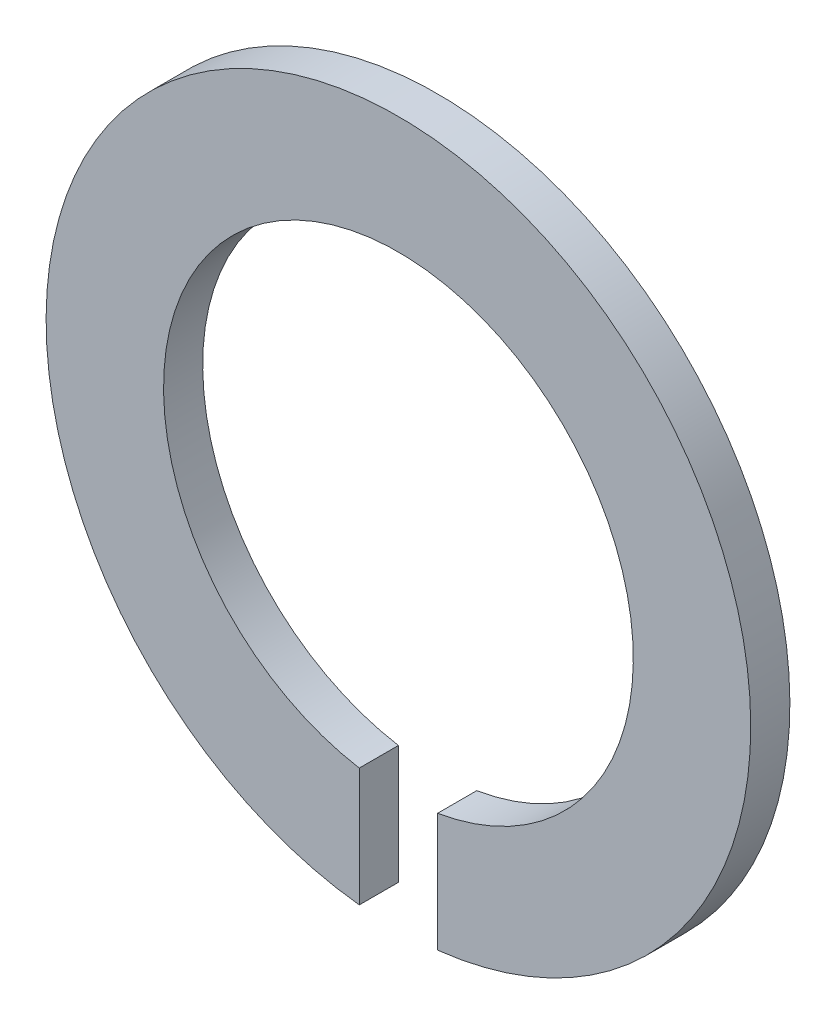
ISO-10303-21;
HEADER;
FILE_DESCRIPTION(('STEP AP214'),'2;1');
FILE_NAME('part.step','',(''),(''),'','','');
FILE_SCHEMA(('AUTOMOTIVE_DESIGN { 1 0 10303 214 1 1 1 1 }'));
ENDSEC;
DATA;
#1=APPLICATION_CONTEXT('core data for automotive mechanical design processes');
#2=APPLICATION_PROTOCOL_DEFINITION('international standard','automotive_design',2000,#1);
#3=PRODUCT_CONTEXT('',#1,'mechanical');
#4=PRODUCT('Part','Part','',(#3));
#5=PRODUCT_RELATED_PRODUCT_CATEGORY('part','',(#4));
#6=PRODUCT_DEFINITION_FORMATION('','',#4);
#7=PRODUCT_DEFINITION_CONTEXT('part definition',#1,'design');
#8=PRODUCT_DEFINITION('design','',#6,#7);
#9=PRODUCT_DEFINITION_SHAPE('','',#8);
#10=(LENGTH_UNIT() NAMED_UNIT(*) SI_UNIT(.MILLI.,.METRE.));
#11=(NAMED_UNIT(*) PLANE_ANGLE_UNIT() SI_UNIT($,.RADIAN.));
#12=(NAMED_UNIT(*) SI_UNIT($,.STERADIAN.) SOLID_ANGLE_UNIT());
#13=UNCERTAINTY_MEASURE_WITH_UNIT(LENGTH_MEASURE(1.E-05),#10,'distance_accuracy_value','');
#14=(GEOMETRIC_REPRESENTATION_CONTEXT(3) GLOBAL_UNCERTAINTY_ASSIGNED_CONTEXT((#13)) GLOBAL_UNIT_ASSIGNED_CONTEXT((#10,
#11,#12)) REPRESENTATION_CONTEXT('',''));
#15=CARTESIAN_POINT('',(0.,0.,0.));
#16=DIRECTION('',(0.,0.,1.));
#17=DIRECTION('',(1.,0.,0.));
#18=AXIS2_PLACEMENT_3D('',#15,#16,#17);
#19=CARTESIAN_POINT('',(0.,0.,0.5));
#20=DIRECTION('',(0.,0.,-1.));
#21=DIRECTION('',(-1.,0.,0.));
#22=AXIS2_PLACEMENT_3D('',#19,#20,#21);
#23=CYLINDRICAL_SURFACE('',#22,4.5);
#24=CARTESIAN_POINT('',(0.,0.,0.));
#25=DIRECTION('',(0.,0.,1.));
#26=DIRECTION('',(1.,0.,0.));
#27=AXIS2_PLACEMENT_3D('',#24,#25,#26);
#28=CIRCLE('',#27,4.5);
#29=CARTESIAN_POINT('',(0.500000000000001,-4.47213595499958,0.));
#30=VERTEX_POINT('',#29);
#31=CARTESIAN_POINT('',(-0.499999999999999,-4.47213595499958,0.));
#32=VERTEX_POINT('',#31);
#33=EDGE_CURVE('E113',#30,#32,#28,.T.);
#34=ORIENTED_EDGE('',*,*,#33,.T.);
#35=DIRECTION('',(0.,0.,-1.));
#36=VECTOR('',#35,1.);
#37=CARTESIAN_POINT('',(-0.499999999999999,-4.47213595499958,0.5));
#38=LINE('',#37,#36);
#39=CARTESIAN_POINT('',(-0.499999999999999,-4.47213595499958,0.5));
#40=VERTEX_POINT('',#39);
#41=EDGE_CURVE('E11',#40,#32,#38,.T.);
#42=ORIENTED_EDGE('',*,*,#41,.F.);
#43=CARTESIAN_POINT('',(0.,0.,0.5));
#44=DIRECTION('',(0.,0.,1.));
#45=DIRECTION('',(1.,0.,0.));
#46=AXIS2_PLACEMENT_3D('',#43,#44,#45);
#47=CIRCLE('',#46,4.5);
#48=CARTESIAN_POINT('',(0.500000000000001,-4.47213595499958,0.5));
#49=VERTEX_POINT('',#48);
#50=EDGE_CURVE('E97',#49,#40,#47,.T.);
#51=ORIENTED_EDGE('',*,*,#50,.F.);
#52=DIRECTION('',(0.,0.,-1.));
#53=VECTOR('',#52,1.);
#54=CARTESIAN_POINT('',(0.500000000000001,-4.47213595499958,0.5));
#55=LINE('',#54,#53);
#56=EDGE_CURVE('E109',#49,#30,#55,.T.);
#57=ORIENTED_EDGE('',*,*,#56,.T.);
#58=EDGE_LOOP('',(#34,#42,#51,#57));
#59=FACE_BOUND('',#58,.T.);
#60=ADVANCED_FACE('F45',(#59),#23,.T.);
#61=CARTESIAN_POINT('',(-0.499999999999999,-4.47213595499958,0.5));
#62=DIRECTION('',(-1.,0.,0.));
#63=DIRECTION('',(0.,-1.,0.));
#64=AXIS2_PLACEMENT_3D('',#61,#62,#63);
#65=PLANE('',#64);
#66=DIRECTION('',(0.,1.,0.));
#67=VECTOR('',#66,1.);
#68=CARTESIAN_POINT('',(-0.499999999999999,-4.47213595499958,0.));
#69=LINE('',#68,#67);
#70=CARTESIAN_POINT('',(-0.499999999999999,-2.95803989154981,0.));
#71=VERTEX_POINT('',#70);
#72=EDGE_CURVE('E102',#32,#71,#69,.T.);
#73=ORIENTED_EDGE('',*,*,#72,.T.);
#74=DIRECTION('',(0.,0.,-1.));
#75=VECTOR('',#74,1.);
#76=CARTESIAN_POINT('',(-0.499999999999999,-2.95803989154981,0.5));
#77=LINE('',#76,#75);
#78=CARTESIAN_POINT('',(-0.499999999999999,-2.95803989154981,0.5));
#79=VERTEX_POINT('',#78);
#80=EDGE_CURVE('E54',#79,#71,#77,.T.);
#81=ORIENTED_EDGE('',*,*,#80,.F.);
#82=DIRECTION('',(0.,1.,0.));
#83=VECTOR('',#82,1.);
#84=CARTESIAN_POINT('',(-0.499999999999999,-4.47213595499958,0.5));
#85=LINE('',#84,#83);
#86=EDGE_CURVE('E92',#40,#79,#85,.T.);
#87=ORIENTED_EDGE('',*,*,#86,.F.);
#88=ORIENTED_EDGE('',*,*,#41,.T.);
#89=EDGE_LOOP('',(#73,#81,#87,#88));
#90=FACE_BOUND('',#89,.T.);
#91=ADVANCED_FACE('F101',(#90),#65,.F.);
#92=CARTESIAN_POINT('',(0.,0.,0.5));
#93=DIRECTION('',(0.,0.,-1.));
#94=DIRECTION('',(-1.,0.,0.));
#95=AXIS2_PLACEMENT_3D('',#92,#93,#94);
#96=CYLINDRICAL_SURFACE('',#95,3.);
#97=CARTESIAN_POINT('',(0.,0.,0.));
#98=DIRECTION('',(0.,0.,-1.));
#99=DIRECTION('',(1.,0.,0.));
#100=AXIS2_PLACEMENT_3D('',#97,#98,#99);
#101=CIRCLE('',#100,3.);
#102=CARTESIAN_POINT('',(0.5,-2.95803989154981,0.));
#103=VERTEX_POINT('',#102);
#104=EDGE_CURVE('E79',#71,#103,#101,.T.);
#105=ORIENTED_EDGE('',*,*,#104,.T.);
#106=DIRECTION('',(0.,0.,-1.));
#107=VECTOR('',#106,1.);
#108=CARTESIAN_POINT('',(0.5,-2.95803989154981,0.5));
#109=LINE('',#108,#107);
#110=CARTESIAN_POINT('',(0.5,-2.95803989154981,0.5));
#111=VERTEX_POINT('',#110);
#112=EDGE_CURVE('E104',#111,#103,#109,.T.);
#113=ORIENTED_EDGE('',*,*,#112,.F.);
#114=CARTESIAN_POINT('',(0.,0.,0.5));
#115=DIRECTION('',(0.,0.,-1.));
#116=DIRECTION('',(1.,0.,0.));
#117=AXIS2_PLACEMENT_3D('',#114,#115,#116);
#118=CIRCLE('',#117,3.);
#119=EDGE_CURVE('E95',#79,#111,#118,.T.);
#120=ORIENTED_EDGE('',*,*,#119,.F.);
#121=ORIENTED_EDGE('',*,*,#80,.T.);
#122=EDGE_LOOP('',(#105,#113,#120,#121));
#123=FACE_BOUND('',#122,.T.);
#124=ADVANCED_FACE('F105',(#123),#96,.F.);
#125=CARTESIAN_POINT('',(0.500000000000001,-4.47213595499958,0.5));
#126=DIRECTION('',(1.,0.,0.));
#127=DIRECTION('',(0.,1.,0.));
#128=AXIS2_PLACEMENT_3D('',#125,#126,#127);
#129=PLANE('',#128);
#130=DIRECTION('',(0.,-1.,0.));
#131=VECTOR('',#130,1.);
#132=CARTESIAN_POINT('',(0.500000000000001,-4.47213595499958,0.));
#133=LINE('',#132,#131);
#134=EDGE_CURVE('E85',#103,#30,#133,.T.);
#135=ORIENTED_EDGE('',*,*,#134,.T.);
#136=ORIENTED_EDGE('',*,*,#56,.F.);
#137=DIRECTION('',(0.,-1.,0.));
#138=VECTOR('',#137,1.);
#139=CARTESIAN_POINT('',(0.500000000000001,-4.47213595499958,0.5));
#140=LINE('',#139,#138);
#141=EDGE_CURVE('E62',#111,#49,#140,.T.);
#142=ORIENTED_EDGE('',*,*,#141,.F.);
#143=ORIENTED_EDGE('',*,*,#112,.T.);
#144=EDGE_LOOP('',(#135,#136,#142,#143));
#145=FACE_BOUND('',#144,.T.);
#146=ADVANCED_FACE('F126',(#145),#129,.F.);
#147=CARTESIAN_POINT('',(0.,0.,0.5));
#148=DIRECTION('',(0.,0.,1.));
#149=DIRECTION('',(1.,0.,0.));
#150=AXIS2_PLACEMENT_3D('',#147,#148,#149);
#151=PLANE('',#150);
#152=ORIENTED_EDGE('',*,*,#50,.T.);
#153=ORIENTED_EDGE('',*,*,#86,.T.);
#154=ORIENTED_EDGE('',*,*,#119,.T.);
#155=ORIENTED_EDGE('',*,*,#141,.T.);
#156=EDGE_LOOP('',(#152,#153,#154,#155));
#157=FACE_BOUND('',#156,.T.);
#158=ADVANCED_FACE('F93',(#157),#151,.T.);
#159=CARTESIAN_POINT('',(0.,0.,0.));
#160=DIRECTION('',(0.,0.,1.));
#161=DIRECTION('',(1.,0.,0.));
#162=AXIS2_PLACEMENT_3D('',#159,#160,#161);
#163=PLANE('',#162);
#164=ORIENTED_EDGE('',*,*,#33,.F.);
#165=ORIENTED_EDGE('',*,*,#134,.F.);
#166=ORIENTED_EDGE('',*,*,#104,.F.);
#167=ORIENTED_EDGE('',*,*,#72,.F.);
#168=EDGE_LOOP('',(#164,#165,#166,#167));
#169=FACE_BOUND('',#168,.T.);
#170=ADVANCED_FACE('F129',(#169),#163,.F.);
#171=CLOSED_SHELL('',(#60,#91,#124,#146,#158,#170));
#172=MANIFOLD_SOLID_BREP('B2',#171);
#173=ADVANCED_BREP_SHAPE_REPRESENTATION('',(#18,#172),#14);
#174=SHAPE_DEFINITION_REPRESENTATION(#9,#173);
ENDSEC;
END-ISO-10303-21;
